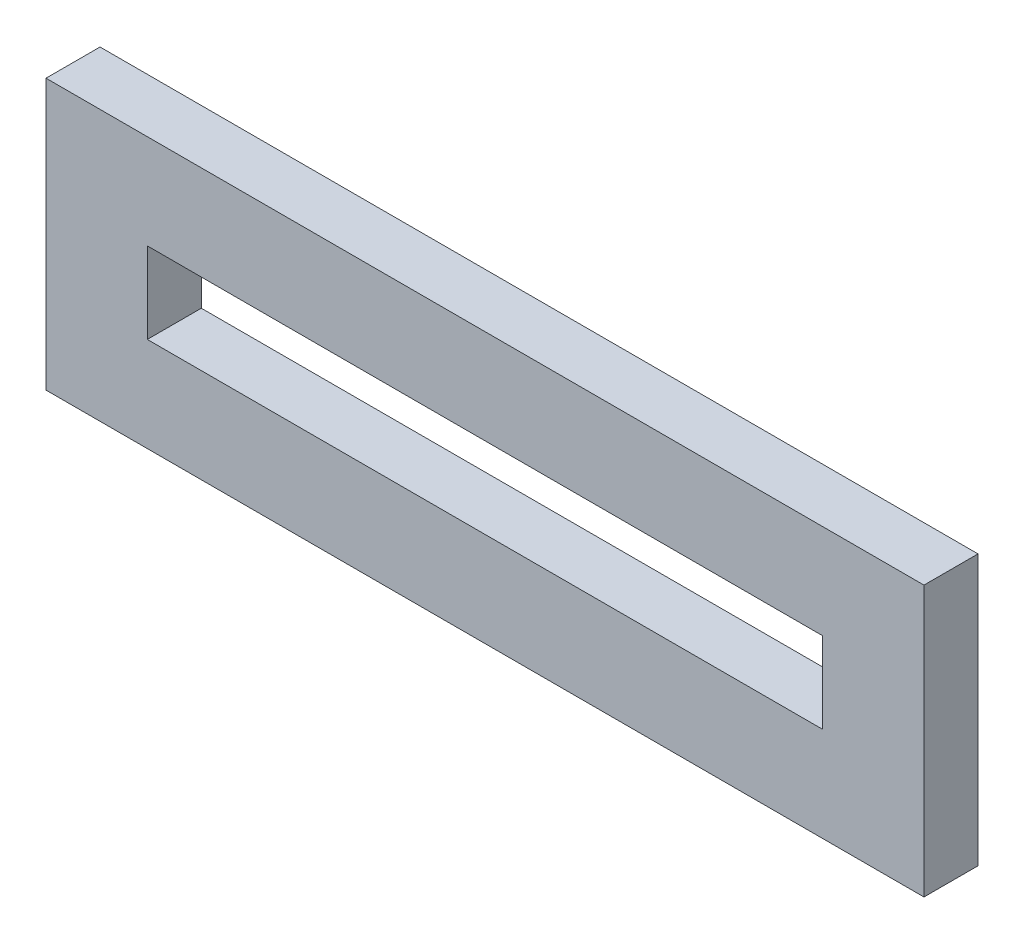
ISO-10303-21;
HEADER;
FILE_DESCRIPTION(('STEP AP214'),'2;1');
FILE_NAME('part.step','',(''),(''),'','','');
FILE_SCHEMA(('AUTOMOTIVE_DESIGN { 1 0 10303 214 1 1 1 1 }'));
ENDSEC;
DATA;
#1=APPLICATION_CONTEXT('core data for automotive mechanical design processes');
#2=APPLICATION_PROTOCOL_DEFINITION('international standard','automotive_design',2000,#1);
#3=PRODUCT_CONTEXT('',#1,'mechanical');
#4=PRODUCT('Part','Part','',(#3));
#5=PRODUCT_RELATED_PRODUCT_CATEGORY('part','',(#4));
#6=PRODUCT_DEFINITION_FORMATION('','',#4);
#7=PRODUCT_DEFINITION_CONTEXT('part definition',#1,'design');
#8=PRODUCT_DEFINITION('design','',#6,#7);
#9=PRODUCT_DEFINITION_SHAPE('','',#8);
#10=(LENGTH_UNIT() NAMED_UNIT(*) SI_UNIT(.MILLI.,.METRE.));
#11=(NAMED_UNIT(*) PLANE_ANGLE_UNIT() SI_UNIT($,.RADIAN.));
#12=(NAMED_UNIT(*) SI_UNIT($,.STERADIAN.) SOLID_ANGLE_UNIT());
#13=UNCERTAINTY_MEASURE_WITH_UNIT(LENGTH_MEASURE(1.E-05),#10,'distance_accuracy_value','');
#14=(GEOMETRIC_REPRESENTATION_CONTEXT(3) GLOBAL_UNCERTAINTY_ASSIGNED_CONTEXT((#13)) GLOBAL_UNIT_ASSIGNED_CONTEXT((#10,
#11,#12)) REPRESENTATION_CONTEXT('',''));
#15=CARTESIAN_POINT('',(0.,0.,0.));
#16=DIRECTION('',(0.,0.,1.));
#17=DIRECTION('',(1.,0.,0.));
#18=AXIS2_PLACEMENT_3D('',#15,#16,#17);
#19=CARTESIAN_POINT('',(0.,0.,4.));
#20=DIRECTION('',(0.,0.,-1.));
#21=DIRECTION('',(-1.,0.,0.));
#22=AXIS2_PLACEMENT_3D('',#19,#20,#21);
#23=PLANE('',#22);
#24=DIRECTION('',(0.,1.,0.));
#25=VECTOR('',#24,1.);
#26=CARTESIAN_POINT('',(32.5,-10.,4.));
#27=LINE('',#26,#25);
#28=CARTESIAN_POINT('',(32.5,-10.,4.));
#29=VERTEX_POINT('',#28);
#30=CARTESIAN_POINT('',(32.5,10.,4.));
#31=VERTEX_POINT('',#30);
#32=EDGE_CURVE('E134',#29,#31,#27,.T.);
#33=ORIENTED_EDGE('',*,*,#32,.T.);
#34=DIRECTION('',(-1.,0.,0.));
#35=VECTOR('',#34,1.);
#36=CARTESIAN_POINT('',(-32.5,10.,4.));
#37=LINE('',#36,#35);
#38=CARTESIAN_POINT('',(-32.5,10.,4.));
#39=VERTEX_POINT('',#38);
#40=EDGE_CURVE('E137',#31,#39,#37,.T.);
#41=ORIENTED_EDGE('',*,*,#40,.T.);
#42=DIRECTION('',(0.,-1.,0.));
#43=VECTOR('',#42,1.);
#44=CARTESIAN_POINT('',(-32.5,-10.,4.));
#45=LINE('',#44,#43);
#46=CARTESIAN_POINT('',(-32.5,-10.,4.));
#47=VERTEX_POINT('',#46);
#48=EDGE_CURVE('E140',#39,#47,#45,.T.);
#49=ORIENTED_EDGE('',*,*,#48,.T.);
#50=DIRECTION('',(1.,0.,0.));
#51=VECTOR('',#50,1.);
#52=CARTESIAN_POINT('',(-32.5,-10.,4.));
#53=LINE('',#52,#51);
#54=EDGE_CURVE('E142',#47,#29,#53,.T.);
#55=ORIENTED_EDGE('',*,*,#54,.T.);
#56=EDGE_LOOP('',(#33,#41,#49,#55));
#57=FACE_BOUND('',#56,.T.);
#58=DIRECTION('',(0.,-1.,0.));
#59=VECTOR('',#58,1.);
#60=CARTESIAN_POINT('',(-25.,0.,4.));
#61=LINE('',#60,#59);
#62=CARTESIAN_POINT('',(-25.,3.,4.));
#63=VERTEX_POINT('',#62);
#64=CARTESIAN_POINT('',(-25.,-3.,4.));
#65=VERTEX_POINT('',#64);
#66=EDGE_CURVE('E101',#63,#65,#61,.T.);
#67=ORIENTED_EDGE('',*,*,#66,.F.);
#68=DIRECTION('',(-1.,0.,0.));
#69=VECTOR('',#68,1.);
#70=CARTESIAN_POINT('',(0.,3.,4.));
#71=LINE('',#70,#69);
#72=CARTESIAN_POINT('',(25.,3.,4.));
#73=VERTEX_POINT('',#72);
#74=EDGE_CURVE('E104',#73,#63,#71,.T.);
#75=ORIENTED_EDGE('',*,*,#74,.F.);
#76=DIRECTION('',(0.,1.,0.));
#77=VECTOR('',#76,1.);
#78=CARTESIAN_POINT('',(25.,0.,4.));
#79=LINE('',#78,#77);
#80=CARTESIAN_POINT('',(25.,-3.,4.));
#81=VERTEX_POINT('',#80);
#82=EDGE_CURVE('E128',#81,#73,#79,.T.);
#83=ORIENTED_EDGE('',*,*,#82,.F.);
#84=DIRECTION('',(1.,0.,0.));
#85=VECTOR('',#84,1.);
#86=CARTESIAN_POINT('',(0.,-3.,4.));
#87=LINE('',#86,#85);
#88=EDGE_CURVE('E130',#65,#81,#87,.T.);
#89=ORIENTED_EDGE('',*,*,#88,.F.);
#90=EDGE_LOOP('',(#67,#75,#83,#89));
#91=FACE_BOUND('',#90,.T.);
#92=ADVANCED_FACE('F33',(#57,#91),#23,.F.);
#93=CARTESIAN_POINT('',(0.,0.,0.));
#94=DIRECTION('',(0.,0.,-1.));
#95=DIRECTION('',(-1.,0.,0.));
#96=AXIS2_PLACEMENT_3D('',#93,#94,#95);
#97=PLANE('',#96);
#98=DIRECTION('',(0.,1.,0.));
#99=VECTOR('',#98,1.);
#100=CARTESIAN_POINT('',(32.5,-10.,0.));
#101=LINE('',#100,#99);
#102=CARTESIAN_POINT('',(32.5,-10.,0.));
#103=VERTEX_POINT('',#102);
#104=CARTESIAN_POINT('',(32.5,10.,0.));
#105=VERTEX_POINT('',#104);
#106=EDGE_CURVE('E133',#103,#105,#101,.T.);
#107=ORIENTED_EDGE('',*,*,#106,.F.);
#108=DIRECTION('',(1.,0.,0.));
#109=VECTOR('',#108,1.);
#110=CARTESIAN_POINT('',(-32.5,-10.,0.));
#111=LINE('',#110,#109);
#112=CARTESIAN_POINT('',(-32.5,-10.,0.));
#113=VERTEX_POINT('',#112);
#114=EDGE_CURVE('E138',#113,#103,#111,.T.);
#115=ORIENTED_EDGE('',*,*,#114,.F.);
#116=DIRECTION('',(0.,-1.,0.));
#117=VECTOR('',#116,1.);
#118=CARTESIAN_POINT('',(-32.5,-10.,0.));
#119=LINE('',#118,#117);
#120=CARTESIAN_POINT('',(-32.5,10.,0.));
#121=VERTEX_POINT('',#120);
#122=EDGE_CURVE('E149',#121,#113,#119,.T.);
#123=ORIENTED_EDGE('',*,*,#122,.F.);
#124=DIRECTION('',(-1.,0.,0.));
#125=VECTOR('',#124,1.);
#126=CARTESIAN_POINT('',(-32.5,10.,0.));
#127=LINE('',#126,#125);
#128=EDGE_CURVE('E147',#105,#121,#127,.T.);
#129=ORIENTED_EDGE('',*,*,#128,.F.);
#130=EDGE_LOOP('',(#107,#115,#123,#129));
#131=FACE_BOUND('',#130,.T.);
#132=DIRECTION('',(-1.,0.,0.));
#133=VECTOR('',#132,1.);
#134=CARTESIAN_POINT('',(25.,3.,0.));
#135=LINE('',#134,#133);
#136=CARTESIAN_POINT('',(25.,3.,0.));
#137=VERTEX_POINT('',#136);
#138=CARTESIAN_POINT('',(-25.,3.,0.));
#139=VERTEX_POINT('',#138);
#140=EDGE_CURVE('E118',#137,#139,#135,.T.);
#141=ORIENTED_EDGE('',*,*,#140,.T.);
#142=DIRECTION('',(0.,-1.,0.));
#143=VECTOR('',#142,1.);
#144=CARTESIAN_POINT('',(-25.,3.,0.));
#145=LINE('',#144,#143);
#146=CARTESIAN_POINT('',(-25.,-3.,0.));
#147=VERTEX_POINT('',#146);
#148=EDGE_CURVE('E56',#139,#147,#145,.T.);
#149=ORIENTED_EDGE('',*,*,#148,.T.);
#150=DIRECTION('',(1.,0.,0.));
#151=VECTOR('',#150,1.);
#152=CARTESIAN_POINT('',(25.,-3.,0.));
#153=LINE('',#152,#151);
#154=CARTESIAN_POINT('',(25.,-3.,0.));
#155=VERTEX_POINT('',#154);
#156=EDGE_CURVE('E108',#147,#155,#153,.T.);
#157=ORIENTED_EDGE('',*,*,#156,.T.);
#158=DIRECTION('',(0.,1.,0.));
#159=VECTOR('',#158,1.);
#160=CARTESIAN_POINT('',(25.,3.,0.));
#161=LINE('',#160,#159);
#162=EDGE_CURVE('E114',#155,#137,#161,.T.);
#163=ORIENTED_EDGE('',*,*,#162,.T.);
#164=EDGE_LOOP('',(#141,#149,#157,#163));
#165=FACE_BOUND('',#164,.T.);
#166=ADVANCED_FACE('F117',(#131,#165),#97,.T.);
#167=CARTESIAN_POINT('',(32.5,-10.,4.));
#168=DIRECTION('',(-1.,0.,0.));
#169=DIRECTION('',(0.,0.,1.));
#170=AXIS2_PLACEMENT_3D('',#167,#168,#169);
#171=PLANE('',#170);
#172=ORIENTED_EDGE('',*,*,#106,.T.);
#173=DIRECTION('',(0.,0.,-1.));
#174=VECTOR('',#173,1.);
#175=CARTESIAN_POINT('',(32.5,10.,4.));
#176=LINE('',#175,#174);
#177=EDGE_CURVE('E11',#31,#105,#176,.T.);
#178=ORIENTED_EDGE('',*,*,#177,.F.);
#179=ORIENTED_EDGE('',*,*,#32,.F.);
#180=DIRECTION('',(0.,0.,-1.));
#181=VECTOR('',#180,1.);
#182=CARTESIAN_POINT('',(32.5,-10.,4.));
#183=LINE('',#182,#181);
#184=EDGE_CURVE('E144',#29,#103,#183,.T.);
#185=ORIENTED_EDGE('',*,*,#184,.T.);
#186=EDGE_LOOP('',(#172,#178,#179,#185));
#187=FACE_BOUND('',#186,.T.);
#188=ADVANCED_FACE('F35',(#187),#171,.F.);
#189=CARTESIAN_POINT('',(-32.5,10.,4.));
#190=DIRECTION('',(0.,-1.,0.));
#191=DIRECTION('',(0.,0.,-1.));
#192=AXIS2_PLACEMENT_3D('',#189,#190,#191);
#193=PLANE('',#192);
#194=ORIENTED_EDGE('',*,*,#128,.T.);
#195=DIRECTION('',(0.,0.,-1.));
#196=VECTOR('',#195,1.);
#197=CARTESIAN_POINT('',(-32.5,10.,4.));
#198=LINE('',#197,#196);
#199=EDGE_CURVE('E41',#39,#121,#198,.T.);
#200=ORIENTED_EDGE('',*,*,#199,.F.);
#201=ORIENTED_EDGE('',*,*,#40,.F.);
#202=ORIENTED_EDGE('',*,*,#177,.T.);
#203=EDGE_LOOP('',(#194,#200,#201,#202));
#204=FACE_BOUND('',#203,.T.);
#205=ADVANCED_FACE('F176',(#204),#193,.F.);
#206=CARTESIAN_POINT('',(-32.5,-10.,4.));
#207=DIRECTION('',(1.,0.,0.));
#208=DIRECTION('',(0.,0.,-1.));
#209=AXIS2_PLACEMENT_3D('',#206,#207,#208);
#210=PLANE('',#209);
#211=ORIENTED_EDGE('',*,*,#122,.T.);
#212=DIRECTION('',(0.,0.,-1.));
#213=VECTOR('',#212,1.);
#214=CARTESIAN_POINT('',(-32.5,-10.,4.));
#215=LINE('',#214,#213);
#216=EDGE_CURVE('E154',#47,#113,#215,.T.);
#217=ORIENTED_EDGE('',*,*,#216,.F.);
#218=ORIENTED_EDGE('',*,*,#48,.F.);
#219=ORIENTED_EDGE('',*,*,#199,.T.);
#220=EDGE_LOOP('',(#211,#217,#218,#219));
#221=FACE_BOUND('',#220,.T.);
#222=ADVANCED_FACE('F161',(#221),#210,.F.);
#223=CARTESIAN_POINT('',(-32.5,-10.,4.));
#224=DIRECTION('',(0.,1.,0.));
#225=DIRECTION('',(0.,0.,1.));
#226=AXIS2_PLACEMENT_3D('',#223,#224,#225);
#227=PLANE('',#226);
#228=ORIENTED_EDGE('',*,*,#114,.T.);
#229=ORIENTED_EDGE('',*,*,#184,.F.);
#230=ORIENTED_EDGE('',*,*,#54,.F.);
#231=ORIENTED_EDGE('',*,*,#216,.T.);
#232=EDGE_LOOP('',(#228,#229,#230,#231));
#233=FACE_BOUND('',#232,.T.);
#234=ADVANCED_FACE('F169',(#233),#227,.F.);
#235=CARTESIAN_POINT('',(-25.,3.,10.));
#236=DIRECTION('',(1.,0.,0.));
#237=DIRECTION('',(0.,0.,-1.));
#238=AXIS2_PLACEMENT_3D('',#235,#236,#237);
#239=PLANE('',#238);
#240=ORIENTED_EDGE('',*,*,#66,.T.);
#241=DIRECTION('',(0.,0.,-1.));
#242=VECTOR('',#241,1.);
#243=CARTESIAN_POINT('',(-25.,-3.,10.));
#244=LINE('',#243,#242);
#245=EDGE_CURVE('E97',#65,#147,#244,.T.);
#246=ORIENTED_EDGE('',*,*,#245,.T.);
#247=ORIENTED_EDGE('',*,*,#148,.F.);
#248=DIRECTION('',(0.,0.,-1.));
#249=VECTOR('',#248,1.);
#250=CARTESIAN_POINT('',(-25.,3.,10.));
#251=LINE('',#250,#249);
#252=EDGE_CURVE('E123',#63,#139,#251,.T.);
#253=ORIENTED_EDGE('',*,*,#252,.F.);
#254=EDGE_LOOP('',(#240,#246,#247,#253));
#255=FACE_BOUND('',#254,.T.);
#256=ADVANCED_FACE('F99',(#255),#239,.T.);
#257=CARTESIAN_POINT('',(25.,-3.,10.));
#258=DIRECTION('',(0.,1.,0.));
#259=DIRECTION('',(-1.,0.,0.));
#260=AXIS2_PLACEMENT_3D('',#257,#258,#259);
#261=PLANE('',#260);
#262=ORIENTED_EDGE('',*,*,#88,.T.);
#263=DIRECTION('',(0.,0.,-1.));
#264=VECTOR('',#263,1.);
#265=CARTESIAN_POINT('',(25.,-3.,10.));
#266=LINE('',#265,#264);
#267=EDGE_CURVE('E105',#81,#155,#266,.T.);
#268=ORIENTED_EDGE('',*,*,#267,.T.);
#269=ORIENTED_EDGE('',*,*,#156,.F.);
#270=ORIENTED_EDGE('',*,*,#245,.F.);
#271=EDGE_LOOP('',(#262,#268,#269,#270));
#272=FACE_BOUND('',#271,.T.);
#273=ADVANCED_FACE('F109',(#272),#261,.T.);
#274=CARTESIAN_POINT('',(25.,3.,10.));
#275=DIRECTION('',(-1.,0.,0.));
#276=DIRECTION('',(0.,0.,1.));
#277=AXIS2_PLACEMENT_3D('',#274,#275,#276);
#278=PLANE('',#277);
#279=ORIENTED_EDGE('',*,*,#82,.T.);
#280=DIRECTION('',(0.,0.,-1.));
#281=VECTOR('',#280,1.);
#282=CARTESIAN_POINT('',(25.,3.,10.));
#283=LINE('',#282,#281);
#284=EDGE_CURVE('E48',#73,#137,#283,.T.);
#285=ORIENTED_EDGE('',*,*,#284,.T.);
#286=ORIENTED_EDGE('',*,*,#162,.F.);
#287=ORIENTED_EDGE('',*,*,#267,.F.);
#288=EDGE_LOOP('',(#279,#285,#286,#287));
#289=FACE_BOUND('',#288,.T.);
#290=ADVANCED_FACE('F201',(#289),#278,.T.);
#291=CARTESIAN_POINT('',(25.,3.,10.));
#292=DIRECTION('',(0.,-1.,0.));
#293=DIRECTION('',(1.,0.,0.));
#294=AXIS2_PLACEMENT_3D('',#291,#292,#293);
#295=PLANE('',#294);
#296=ORIENTED_EDGE('',*,*,#74,.T.);
#297=ORIENTED_EDGE('',*,*,#252,.T.);
#298=ORIENTED_EDGE('',*,*,#140,.F.);
#299=ORIENTED_EDGE('',*,*,#284,.F.);
#300=EDGE_LOOP('',(#296,#297,#298,#299));
#301=FACE_BOUND('',#300,.T.);
#302=ADVANCED_FACE('F205',(#301),#295,.T.);
#303=CLOSED_SHELL('',(#92,#166,#188,#205,#222,#234,#256,#273,#290,#302));
#304=MANIFOLD_SOLID_BREP('B2',#303);
#305=ADVANCED_BREP_SHAPE_REPRESENTATION('',(#18,#304),#14);
#306=SHAPE_DEFINITION_REPRESENTATION(#9,#305);
ENDSEC;
END-ISO-10303-21;
